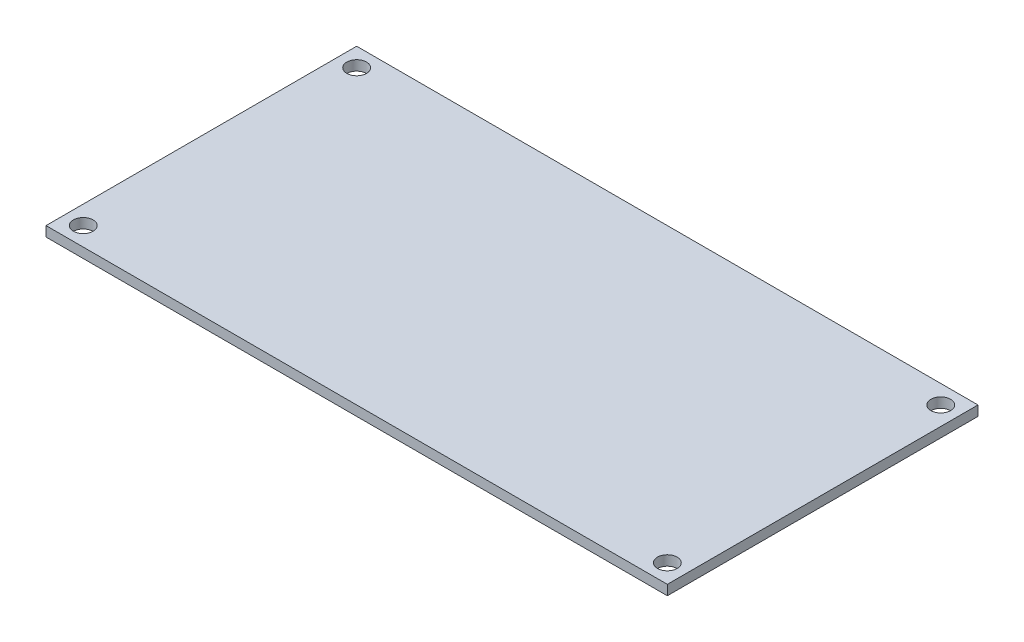
ISO-10303-21;
HEADER;
FILE_DESCRIPTION(('STEP AP214'),'2;1');
FILE_NAME('part.step','',(''),(''),'','','');
FILE_SCHEMA(('AUTOMOTIVE_DESIGN { 1 0 10303 214 1 1 1 1 }'));
ENDSEC;
DATA;
#1=APPLICATION_CONTEXT('core data for automotive mechanical design processes');
#2=APPLICATION_PROTOCOL_DEFINITION('international standard','automotive_design',2000,#1);
#3=PRODUCT_CONTEXT('',#1,'mechanical');
#4=PRODUCT('Part','Part','',(#3));
#5=PRODUCT_RELATED_PRODUCT_CATEGORY('part','',(#4));
#6=PRODUCT_DEFINITION_FORMATION('','',#4);
#7=PRODUCT_DEFINITION_CONTEXT('part definition',#1,'design');
#8=PRODUCT_DEFINITION('design','',#6,#7);
#9=PRODUCT_DEFINITION_SHAPE('','',#8);
#10=(LENGTH_UNIT() NAMED_UNIT(*) SI_UNIT(.MILLI.,.METRE.));
#11=(NAMED_UNIT(*) PLANE_ANGLE_UNIT() SI_UNIT($,.RADIAN.));
#12=(NAMED_UNIT(*) SI_UNIT($,.STERADIAN.) SOLID_ANGLE_UNIT());
#13=UNCERTAINTY_MEASURE_WITH_UNIT(LENGTH_MEASURE(1.E-05),#10,'distance_accuracy_value','');
#14=(GEOMETRIC_REPRESENTATION_CONTEXT(3) GLOBAL_UNCERTAINTY_ASSIGNED_CONTEXT((#13)) GLOBAL_UNIT_ASSIGNED_CONTEXT((#10,
#11,#12)) REPRESENTATION_CONTEXT('',''));
#15=CARTESIAN_POINT('',(0.,0.,0.));
#16=DIRECTION('',(0.,0.,1.));
#17=DIRECTION('',(1.,0.,0.));
#18=AXIS2_PLACEMENT_3D('',#15,#16,#17);
#19=CARTESIAN_POINT('',(0.,1.6,0.));
#20=DIRECTION('',(0.,-1.,0.));
#21=DIRECTION('',(0.,0.,-1.));
#22=AXIS2_PLACEMENT_3D('',#19,#20,#21);
#23=PLANE('',#22);
#24=CARTESIAN_POINT('',(97.,1.6,-3.));
#25=DIRECTION('',(0.,1.,0.));
#26=DIRECTION('',(0.,0.,1.));
#27=AXIS2_PLACEMENT_3D('',#24,#25,#26);
#28=CIRCLE('',#27,1.5875);
#29=CARTESIAN_POINT('',(97.,1.6,-1.4125));
#30=VERTEX_POINT('',#29);
#31=EDGE_CURVE('E123',#30,#30,#28,.T.);
#32=ORIENTED_EDGE('',*,*,#31,.F.);
#33=EDGE_LOOP('',(#32));
#34=FACE_BOUND('',#33,.T.);
#35=CARTESIAN_POINT('',(3.,1.6,-47.));
#36=DIRECTION('',(0.,1.,0.));
#37=DIRECTION('',(0.,0.,1.));
#38=AXIS2_PLACEMENT_3D('',#35,#36,#37);
#39=CIRCLE('',#38,1.5875);
#40=CARTESIAN_POINT('',(3.,1.6,-45.4125));
#41=VERTEX_POINT('',#40);
#42=EDGE_CURVE('E102',#41,#41,#39,.T.);
#43=ORIENTED_EDGE('',*,*,#42,.F.);
#44=EDGE_LOOP('',(#43));
#45=FACE_BOUND('',#44,.T.);
#46=DIRECTION('',(0.,0.,1.));
#47=VECTOR('',#46,1.);
#48=CARTESIAN_POINT('',(0.,1.6,0.));
#49=LINE('',#48,#47);
#50=CARTESIAN_POINT('',(0.,1.6,-50.));
#51=VERTEX_POINT('',#50);
#52=CARTESIAN_POINT('',(0.,1.6,0.));
#53=VERTEX_POINT('',#52);
#54=EDGE_CURVE('E87',#51,#53,#49,.T.);
#55=ORIENTED_EDGE('',*,*,#54,.T.);
#56=DIRECTION('',(1.,0.,0.));
#57=VECTOR('',#56,1.);
#58=CARTESIAN_POINT('',(0.,1.6,0.));
#59=LINE('',#58,#57);
#60=CARTESIAN_POINT('',(100.,1.6,0.));
#61=VERTEX_POINT('',#60);
#62=EDGE_CURVE('E82',#53,#61,#59,.T.);
#63=ORIENTED_EDGE('',*,*,#62,.T.);
#64=DIRECTION('',(0.,0.,-1.));
#65=VECTOR('',#64,1.);
#66=CARTESIAN_POINT('',(100.,1.6,0.));
#67=LINE('',#66,#65);
#68=CARTESIAN_POINT('',(100.,1.6,-50.));
#69=VERTEX_POINT('',#68);
#70=EDGE_CURVE('E85',#61,#69,#67,.T.);
#71=ORIENTED_EDGE('',*,*,#70,.T.);
#72=DIRECTION('',(-1.,0.,0.));
#73=VECTOR('',#72,1.);
#74=CARTESIAN_POINT('',(0.,1.6,-50.));
#75=LINE('',#74,#73);
#76=EDGE_CURVE('E52',#69,#51,#75,.T.);
#77=ORIENTED_EDGE('',*,*,#76,.T.);
#78=EDGE_LOOP('',(#55,#63,#71,#77));
#79=FACE_BOUND('',#78,.T.);
#80=CARTESIAN_POINT('',(3.,1.6,-3.));
#81=DIRECTION('',(0.,1.,0.));
#82=DIRECTION('',(0.,0.,1.));
#83=AXIS2_PLACEMENT_3D('',#80,#81,#82);
#84=CIRCLE('',#83,1.5875);
#85=CARTESIAN_POINT('',(3.,1.6,-1.4125));
#86=VERTEX_POINT('',#85);
#87=EDGE_CURVE('E117',#86,#86,#84,.T.);
#88=ORIENTED_EDGE('',*,*,#87,.F.);
#89=EDGE_LOOP('',(#88));
#90=FACE_BOUND('',#89,.T.);
#91=CARTESIAN_POINT('',(97.,1.6,-47.));
#92=DIRECTION('',(0.,1.,0.));
#93=DIRECTION('',(0.,0.,1.));
#94=AXIS2_PLACEMENT_3D('',#91,#92,#93);
#95=CIRCLE('',#94,1.58749999999999);
#96=CARTESIAN_POINT('',(97.,1.6,-45.4125));
#97=VERTEX_POINT('',#96);
#98=EDGE_CURVE('E129',#97,#97,#95,.T.);
#99=ORIENTED_EDGE('',*,*,#98,.F.);
#100=EDGE_LOOP('',(#99));
#101=FACE_BOUND('',#100,.T.);
#102=ADVANCED_FACE('F35',(#34,#45,#79,#90,#101),#23,.F.);
#103=CARTESIAN_POINT('',(0.,0.,0.));
#104=DIRECTION('',(0.,-1.,0.));
#105=DIRECTION('',(0.,0.,-1.));
#106=AXIS2_PLACEMENT_3D('',#103,#104,#105);
#107=PLANE('',#106);
#108=CARTESIAN_POINT('',(97.,0.,-3.));
#109=DIRECTION('',(0.,1.,0.));
#110=DIRECTION('',(0.,0.,1.));
#111=AXIS2_PLACEMENT_3D('',#108,#109,#110);
#112=CIRCLE('',#111,1.5875);
#113=CARTESIAN_POINT('',(97.,0.,-1.4125));
#114=VERTEX_POINT('',#113);
#115=EDGE_CURVE('E126',#114,#114,#112,.T.);
#116=ORIENTED_EDGE('',*,*,#115,.T.);
#117=EDGE_LOOP('',(#116));
#118=FACE_BOUND('',#117,.T.);
#119=CARTESIAN_POINT('',(3.,0.,-47.));
#120=DIRECTION('',(0.,1.,0.));
#121=DIRECTION('',(0.,0.,1.));
#122=AXIS2_PLACEMENT_3D('',#119,#120,#121);
#123=CIRCLE('',#122,1.5875);
#124=CARTESIAN_POINT('',(3.,0.,-45.4125));
#125=VERTEX_POINT('',#124);
#126=EDGE_CURVE('E114',#125,#125,#123,.T.);
#127=ORIENTED_EDGE('',*,*,#126,.T.);
#128=EDGE_LOOP('',(#127));
#129=FACE_BOUND('',#128,.T.);
#130=DIRECTION('',(0.,0.,1.));
#131=VECTOR('',#130,1.);
#132=CARTESIAN_POINT('',(0.,0.,0.));
#133=LINE('',#132,#131);
#134=CARTESIAN_POINT('',(0.,0.,-50.));
#135=VERTEX_POINT('',#134);
#136=CARTESIAN_POINT('',(0.,0.,0.));
#137=VERTEX_POINT('',#136);
#138=EDGE_CURVE('E99',#135,#137,#133,.T.);
#139=ORIENTED_EDGE('',*,*,#138,.F.);
#140=DIRECTION('',(-1.,0.,0.));
#141=VECTOR('',#140,1.);
#142=CARTESIAN_POINT('',(0.,0.,-50.));
#143=LINE('',#142,#141);
#144=CARTESIAN_POINT('',(100.,0.,-50.));
#145=VERTEX_POINT('',#144);
#146=EDGE_CURVE('E75',#145,#135,#143,.T.);
#147=ORIENTED_EDGE('',*,*,#146,.F.);
#148=DIRECTION('',(0.,0.,-1.));
#149=VECTOR('',#148,1.);
#150=CARTESIAN_POINT('',(100.,0.,0.));
#151=LINE('',#150,#149);
#152=CARTESIAN_POINT('',(100.,0.,0.));
#153=VERTEX_POINT('',#152);
#154=EDGE_CURVE('E69',#153,#145,#151,.T.);
#155=ORIENTED_EDGE('',*,*,#154,.F.);
#156=DIRECTION('',(1.,0.,0.));
#157=VECTOR('',#156,1.);
#158=CARTESIAN_POINT('',(0.,0.,0.));
#159=LINE('',#158,#157);
#160=EDGE_CURVE('E91',#137,#153,#159,.T.);
#161=ORIENTED_EDGE('',*,*,#160,.F.);
#162=EDGE_LOOP('',(#139,#147,#155,#161));
#163=FACE_BOUND('',#162,.T.);
#164=CARTESIAN_POINT('',(3.,0.,-3.));
#165=DIRECTION('',(0.,1.,0.));
#166=DIRECTION('',(0.,0.,1.));
#167=AXIS2_PLACEMENT_3D('',#164,#165,#166);
#168=CIRCLE('',#167,1.5875);
#169=CARTESIAN_POINT('',(3.,0.,-1.4125));
#170=VERTEX_POINT('',#169);
#171=EDGE_CURVE('E120',#170,#170,#168,.T.);
#172=ORIENTED_EDGE('',*,*,#171,.T.);
#173=EDGE_LOOP('',(#172));
#174=FACE_BOUND('',#173,.T.);
#175=CARTESIAN_POINT('',(97.,0.,-47.));
#176=DIRECTION('',(0.,1.,0.));
#177=DIRECTION('',(0.,0.,1.));
#178=AXIS2_PLACEMENT_3D('',#175,#176,#177);
#179=CIRCLE('',#178,1.58749999999999);
#180=CARTESIAN_POINT('',(97.,0.,-45.4125));
#181=VERTEX_POINT('',#180);
#182=EDGE_CURVE('E132',#181,#181,#179,.T.);
#183=ORIENTED_EDGE('',*,*,#182,.T.);
#184=EDGE_LOOP('',(#183));
#185=FACE_BOUND('',#184,.T.);
#186=ADVANCED_FACE('F110',(#118,#129,#163,#174,#185),#107,.T.);
#187=CARTESIAN_POINT('',(0.,1.6,0.));
#188=DIRECTION('',(1.,0.,0.));
#189=DIRECTION('',(0.,0.,-1.));
#190=AXIS2_PLACEMENT_3D('',#187,#188,#189);
#191=PLANE('',#190);
#192=ORIENTED_EDGE('',*,*,#138,.T.);
#193=DIRECTION('',(0.,-1.,0.));
#194=VECTOR('',#193,1.);
#195=CARTESIAN_POINT('',(0.,1.6,0.));
#196=LINE('',#195,#194);
#197=EDGE_CURVE('E11',#53,#137,#196,.T.);
#198=ORIENTED_EDGE('',*,*,#197,.F.);
#199=ORIENTED_EDGE('',*,*,#54,.F.);
#200=DIRECTION('',(0.,-1.,0.));
#201=VECTOR('',#200,1.);
#202=CARTESIAN_POINT('',(0.,1.6,-50.));
#203=LINE('',#202,#201);
#204=EDGE_CURVE('E95',#51,#135,#203,.T.);
#205=ORIENTED_EDGE('',*,*,#204,.T.);
#206=EDGE_LOOP('',(#192,#198,#199,#205));
#207=FACE_BOUND('',#206,.T.);
#208=ADVANCED_FACE('F37',(#207),#191,.F.);
#209=CARTESIAN_POINT('',(0.,1.6,0.));
#210=DIRECTION('',(0.,0.,-1.));
#211=DIRECTION('',(-1.,0.,0.));
#212=AXIS2_PLACEMENT_3D('',#209,#210,#211);
#213=PLANE('',#212);
#214=ORIENTED_EDGE('',*,*,#160,.T.);
#215=DIRECTION('',(0.,-1.,0.));
#216=VECTOR('',#215,1.);
#217=CARTESIAN_POINT('',(100.,1.6,0.));
#218=LINE('',#217,#216);
#219=EDGE_CURVE('E44',#61,#153,#218,.T.);
#220=ORIENTED_EDGE('',*,*,#219,.F.);
#221=ORIENTED_EDGE('',*,*,#62,.F.);
#222=ORIENTED_EDGE('',*,*,#197,.T.);
#223=EDGE_LOOP('',(#214,#220,#221,#222));
#224=FACE_BOUND('',#223,.T.);
#225=ADVANCED_FACE('F90',(#224),#213,.F.);
#226=CARTESIAN_POINT('',(100.,1.6,0.));
#227=DIRECTION('',(-1.,0.,0.));
#228=DIRECTION('',(0.,0.,1.));
#229=AXIS2_PLACEMENT_3D('',#226,#227,#228);
#230=PLANE('',#229);
#231=ORIENTED_EDGE('',*,*,#154,.T.);
#232=DIRECTION('',(0.,-1.,0.));
#233=VECTOR('',#232,1.);
#234=CARTESIAN_POINT('',(100.,1.6,-50.));
#235=LINE('',#234,#233);
#236=EDGE_CURVE('E92',#69,#145,#235,.T.);
#237=ORIENTED_EDGE('',*,*,#236,.F.);
#238=ORIENTED_EDGE('',*,*,#70,.F.);
#239=ORIENTED_EDGE('',*,*,#219,.T.);
#240=EDGE_LOOP('',(#231,#237,#238,#239));
#241=FACE_BOUND('',#240,.T.);
#242=ADVANCED_FACE('F93',(#241),#230,.F.);
#243=CARTESIAN_POINT('',(0.,1.6,-50.));
#244=DIRECTION('',(0.,0.,1.));
#245=DIRECTION('',(1.,0.,0.));
#246=AXIS2_PLACEMENT_3D('',#243,#244,#245);
#247=PLANE('',#246);
#248=ORIENTED_EDGE('',*,*,#146,.T.);
#249=ORIENTED_EDGE('',*,*,#204,.F.);
#250=ORIENTED_EDGE('',*,*,#76,.F.);
#251=ORIENTED_EDGE('',*,*,#236,.T.);
#252=EDGE_LOOP('',(#248,#249,#250,#251));
#253=FACE_BOUND('',#252,.T.);
#254=ADVANCED_FACE('F107',(#253),#247,.F.);
#255=CARTESIAN_POINT('',(3.,1.6,-47.));
#256=DIRECTION('',(0.,-1.,0.));
#257=DIRECTION('',(0.,0.,-1.));
#258=AXIS2_PLACEMENT_3D('',#255,#256,#257);
#259=CYLINDRICAL_SURFACE('',#258,1.5875);
#260=ORIENTED_EDGE('',*,*,#42,.T.);
#261=EDGE_LOOP('',(#260));
#262=FACE_BOUND('',#261,.T.);
#263=ORIENTED_EDGE('',*,*,#126,.F.);
#264=EDGE_LOOP('',(#263));
#265=FACE_BOUND('',#264,.T.);
#266=ADVANCED_FACE('F152',(#262,#265),#259,.F.);
#267=CARTESIAN_POINT('',(3.,1.6,-3.));
#268=DIRECTION('',(0.,-1.,0.));
#269=DIRECTION('',(0.,0.,-1.));
#270=AXIS2_PLACEMENT_3D('',#267,#268,#269);
#271=CYLINDRICAL_SURFACE('',#270,1.5875);
#272=ORIENTED_EDGE('',*,*,#87,.T.);
#273=EDGE_LOOP('',(#272));
#274=FACE_BOUND('',#273,.T.);
#275=ORIENTED_EDGE('',*,*,#171,.F.);
#276=EDGE_LOOP('',(#275));
#277=FACE_BOUND('',#276,.T.);
#278=ADVANCED_FACE('F203',(#274,#277),#271,.F.);
#279=CARTESIAN_POINT('',(97.,1.6,-3.));
#280=DIRECTION('',(0.,-1.,0.));
#281=DIRECTION('',(0.,0.,-1.));
#282=AXIS2_PLACEMENT_3D('',#279,#280,#281);
#283=CYLINDRICAL_SURFACE('',#282,1.5875);
#284=ORIENTED_EDGE('',*,*,#31,.T.);
#285=EDGE_LOOP('',(#284));
#286=FACE_BOUND('',#285,.T.);
#287=ORIENTED_EDGE('',*,*,#115,.F.);
#288=EDGE_LOOP('',(#287));
#289=FACE_BOUND('',#288,.T.);
#290=ADVANCED_FACE('F212',(#286,#289),#283,.F.);
#291=CARTESIAN_POINT('',(97.,1.6,-47.));
#292=DIRECTION('',(0.,-1.,0.));
#293=DIRECTION('',(0.,0.,-1.));
#294=AXIS2_PLACEMENT_3D('',#291,#292,#293);
#295=CYLINDRICAL_SURFACE('',#294,1.58749999999999);
#296=ORIENTED_EDGE('',*,*,#98,.T.);
#297=EDGE_LOOP('',(#296));
#298=FACE_BOUND('',#297,.T.);
#299=ORIENTED_EDGE('',*,*,#182,.F.);
#300=EDGE_LOOP('',(#299));
#301=FACE_BOUND('',#300,.T.);
#302=ADVANCED_FACE('F138',(#298,#301),#295,.F.);
#303=CLOSED_SHELL('',(#102,#186,#208,#225,#242,#254,#266,#278,#290,#302));
#304=MANIFOLD_SOLID_BREP('B2',#303);
#305=ADVANCED_BREP_SHAPE_REPRESENTATION('',(#18,#304),#14);
#306=SHAPE_DEFINITION_REPRESENTATION(#9,#305);
ENDSEC;
END-ISO-10303-21;
